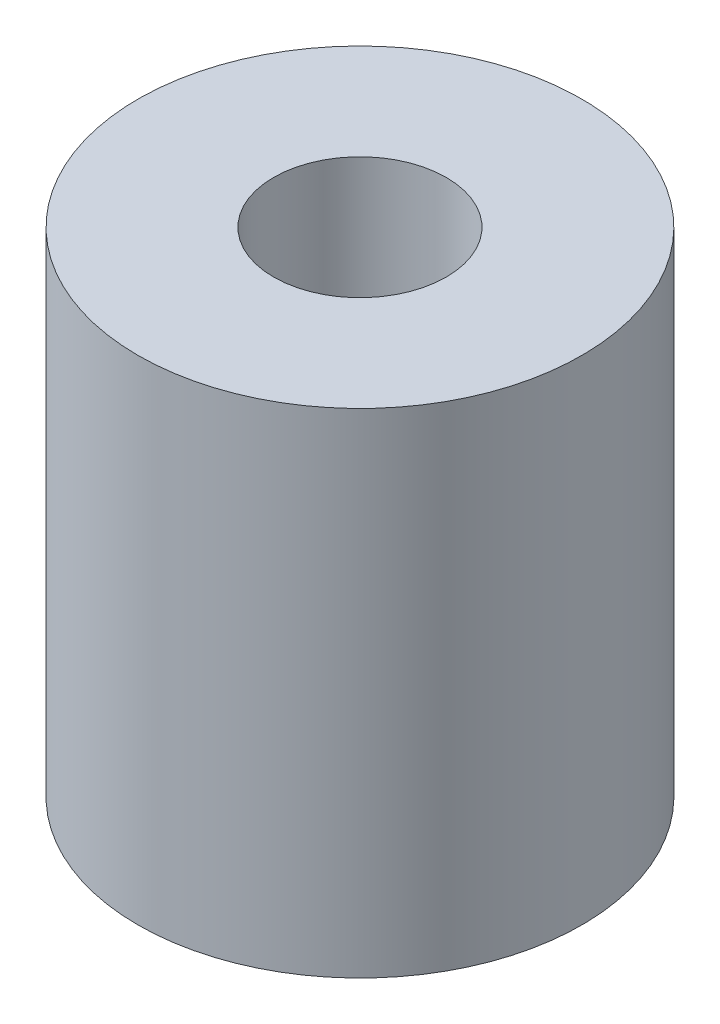
ISO-10303-21;
HEADER;
FILE_DESCRIPTION(('STEP AP214'),'2;1');
FILE_NAME('part.step','',(''),(''),'','','');
FILE_SCHEMA(('AUTOMOTIVE_DESIGN { 1 0 10303 214 1 1 1 1 }'));
ENDSEC;
DATA;
#1=APPLICATION_CONTEXT('core data for automotive mechanical design processes');
#2=APPLICATION_PROTOCOL_DEFINITION('international standard','automotive_design',2000,#1);
#3=PRODUCT_CONTEXT('',#1,'mechanical');
#4=PRODUCT('Part','Part','',(#3));
#5=PRODUCT_RELATED_PRODUCT_CATEGORY('part','',(#4));
#6=PRODUCT_DEFINITION_FORMATION('','',#4);
#7=PRODUCT_DEFINITION_CONTEXT('part definition',#1,'design');
#8=PRODUCT_DEFINITION('design','',#6,#7);
#9=PRODUCT_DEFINITION_SHAPE('','',#8);
#10=(LENGTH_UNIT() NAMED_UNIT(*) SI_UNIT(.MILLI.,.METRE.));
#11=(NAMED_UNIT(*) PLANE_ANGLE_UNIT() SI_UNIT($,.RADIAN.));
#12=(NAMED_UNIT(*) SI_UNIT($,.STERADIAN.) SOLID_ANGLE_UNIT());
#13=UNCERTAINTY_MEASURE_WITH_UNIT(LENGTH_MEASURE(1.E-05),#10,'distance_accuracy_value','');
#14=(GEOMETRIC_REPRESENTATION_CONTEXT(3) GLOBAL_UNCERTAINTY_ASSIGNED_CONTEXT((#13)) GLOBAL_UNIT_ASSIGNED_CONTEXT((#10,
#11,#12)) REPRESENTATION_CONTEXT('',''));
#15=CARTESIAN_POINT('',(0.,0.,0.));
#16=DIRECTION('',(0.,0.,1.));
#17=DIRECTION('',(1.,0.,0.));
#18=AXIS2_PLACEMENT_3D('',#15,#16,#17);
#19=CARTESIAN_POINT('',(0.,10.,0.));
#20=DIRECTION('',(0.,-1.,0.));
#21=DIRECTION('',(0.,0.,-1.));
#22=AXIS2_PLACEMENT_3D('',#19,#20,#21);
#23=CYLINDRICAL_SURFACE('',#22,1.75);
#24=CARTESIAN_POINT('',(0.,10.,0.));
#25=DIRECTION('',(0.,1.,0.));
#26=DIRECTION('',(0.,0.,1.));
#27=AXIS2_PLACEMENT_3D('',#24,#25,#26);
#28=CIRCLE('',#27,1.75);
#29=CARTESIAN_POINT('',(0.,10.,1.75));
#30=VERTEX_POINT('',#29);
#31=EDGE_CURVE('E46',#30,#30,#28,.T.);
#32=ORIENTED_EDGE('',*,*,#31,.T.);
#33=EDGE_LOOP('',(#32));
#34=FACE_BOUND('',#33,.T.);
#35=CARTESIAN_POINT('',(0.,0.,0.));
#36=DIRECTION('',(0.,1.,0.));
#37=DIRECTION('',(0.,0.,1.));
#38=AXIS2_PLACEMENT_3D('',#35,#36,#37);
#39=CIRCLE('',#38,1.75);
#40=CARTESIAN_POINT('',(0.,0.,1.75));
#41=VERTEX_POINT('',#40);
#42=EDGE_CURVE('E52',#41,#41,#39,.T.);
#43=ORIENTED_EDGE('',*,*,#42,.F.);
#44=EDGE_LOOP('',(#43));
#45=FACE_BOUND('',#44,.T.);
#46=ADVANCED_FACE('F39',(#34,#45),#23,.F.);
#47=CARTESIAN_POINT('',(0.,10.,0.));
#48=DIRECTION('',(0.,-1.,0.));
#49=DIRECTION('',(0.,0.,-1.));
#50=AXIS2_PLACEMENT_3D('',#47,#48,#49);
#51=CYLINDRICAL_SURFACE('',#50,4.5);
#52=CARTESIAN_POINT('',(0.,10.,0.));
#53=DIRECTION('',(0.,1.,0.));
#54=DIRECTION('',(0.,0.,1.));
#55=AXIS2_PLACEMENT_3D('',#52,#53,#54);
#56=CIRCLE('',#55,4.5);
#57=CARTESIAN_POINT('',(0.,10.,4.5));
#58=VERTEX_POINT('',#57);
#59=EDGE_CURVE('E10',#58,#58,#56,.T.);
#60=ORIENTED_EDGE('',*,*,#59,.F.);
#61=EDGE_LOOP('',(#60));
#62=FACE_BOUND('',#61,.T.);
#63=CARTESIAN_POINT('',(0.,0.,0.));
#64=DIRECTION('',(0.,1.,0.));
#65=DIRECTION('',(0.,0.,1.));
#66=AXIS2_PLACEMENT_3D('',#63,#64,#65);
#67=CIRCLE('',#66,4.5);
#68=CARTESIAN_POINT('',(0.,0.,4.5));
#69=VERTEX_POINT('',#68);
#70=EDGE_CURVE('E42',#69,#69,#67,.T.);
#71=ORIENTED_EDGE('',*,*,#70,.T.);
#72=EDGE_LOOP('',(#71));
#73=FACE_BOUND('',#72,.T.);
#74=ADVANCED_FACE('F59',(#62,#73),#51,.T.);
#75=CARTESIAN_POINT('',(0.,10.,0.));
#76=DIRECTION('',(0.,1.,0.));
#77=DIRECTION('',(0.,0.,1.));
#78=AXIS2_PLACEMENT_3D('',#75,#76,#77);
#79=PLANE('',#78);
#80=ORIENTED_EDGE('',*,*,#31,.F.);
#81=EDGE_LOOP('',(#80));
#82=FACE_BOUND('',#81,.T.);
#83=ORIENTED_EDGE('',*,*,#59,.T.);
#84=EDGE_LOOP('',(#83));
#85=FACE_BOUND('',#84,.T.);
#86=ADVANCED_FACE('F63',(#82,#85),#79,.T.);
#87=CARTESIAN_POINT('',(0.,0.,0.));
#88=DIRECTION('',(0.,1.,0.));
#89=DIRECTION('',(0.,0.,1.));
#90=AXIS2_PLACEMENT_3D('',#87,#88,#89);
#91=PLANE('',#90);
#92=ORIENTED_EDGE('',*,*,#42,.T.);
#93=EDGE_LOOP('',(#92));
#94=FACE_BOUND('',#93,.T.);
#95=ORIENTED_EDGE('',*,*,#70,.F.);
#96=EDGE_LOOP('',(#95));
#97=FACE_BOUND('',#96,.T.);
#98=ADVANCED_FACE('F61',(#94,#97),#91,.F.);
#99=CLOSED_SHELL('',(#46,#74,#86,#98));
#100=MANIFOLD_SOLID_BREP('B2',#99);
#101=ADVANCED_BREP_SHAPE_REPRESENTATION('',(#18,#100),#14);
#102=SHAPE_DEFINITION_REPRESENTATION(#9,#101);
ENDSEC;
END-ISO-10303-21;
